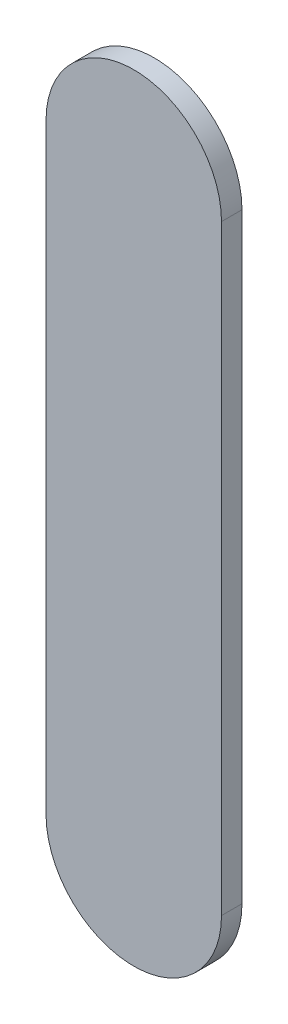
ISO-10303-21;
HEADER;
FILE_DESCRIPTION(('STEP AP214'),'2;1');
FILE_NAME('part.step','',(''),(''),'','','');
FILE_SCHEMA(('AUTOMOTIVE_DESIGN { 1 0 10303 214 1 1 1 1 }'));
ENDSEC;
DATA;
#1=APPLICATION_CONTEXT('core data for automotive mechanical design processes');
#2=APPLICATION_PROTOCOL_DEFINITION('international standard','automotive_design',2000,#1);
#3=PRODUCT_CONTEXT('',#1,'mechanical');
#4=PRODUCT('Part','Part','',(#3));
#5=PRODUCT_RELATED_PRODUCT_CATEGORY('part','',(#4));
#6=PRODUCT_DEFINITION_FORMATION('','',#4);
#7=PRODUCT_DEFINITION_CONTEXT('part definition',#1,'design');
#8=PRODUCT_DEFINITION('design','',#6,#7);
#9=PRODUCT_DEFINITION_SHAPE('','',#8);
#10=(LENGTH_UNIT() NAMED_UNIT(*) SI_UNIT(.MILLI.,.METRE.));
#11=(NAMED_UNIT(*) PLANE_ANGLE_UNIT() SI_UNIT($,.RADIAN.));
#12=(NAMED_UNIT(*) SI_UNIT($,.STERADIAN.) SOLID_ANGLE_UNIT());
#13=UNCERTAINTY_MEASURE_WITH_UNIT(LENGTH_MEASURE(1.E-05),#10,'distance_accuracy_value','');
#14=(GEOMETRIC_REPRESENTATION_CONTEXT(3) GLOBAL_UNCERTAINTY_ASSIGNED_CONTEXT((#13)) GLOBAL_UNIT_ASSIGNED_CONTEXT((#10,
#11,#12)) REPRESENTATION_CONTEXT('',''));
#15=CARTESIAN_POINT('',(0.,0.,0.));
#16=DIRECTION('',(0.,0.,1.));
#17=DIRECTION('',(1.,0.,0.));
#18=AXIS2_PLACEMENT_3D('',#15,#16,#17);
#19=CARTESIAN_POINT('',(129.35,-69.9125,1.635));
#20=DIRECTION('',(0.,0.,1.));
#21=DIRECTION('',(1.,0.,0.));
#22=AXIS2_PLACEMENT_3D('',#19,#20,#21);
#23=PLANE('',#22);
#24=DIRECTION('',(0.,-1.,0.));
#25=VECTOR('',#24,1.);
#26=CARTESIAN_POINT('',(129.35,-69.9125,1.635));
#27=LINE('',#26,#25);
#28=CARTESIAN_POINT('',(129.35,-69.9125,1.635));
#29=VERTEX_POINT('',#28);
#30=CARTESIAN_POINT('',(129.35,-70.94,1.635));
#31=VERTEX_POINT('',#30);
#32=EDGE_CURVE('E82',#29,#31,#27,.T.);
#33=ORIENTED_EDGE('',*,*,#32,.T.);
#34=CARTESIAN_POINT('',(129.5,-70.94,1.635));
#35=DIRECTION('',(0.,0.,1.));
#36=DIRECTION('',(-1.,0.,0.));
#37=AXIS2_PLACEMENT_3D('',#34,#35,#36);
#38=CIRCLE('',#37,0.15);
#39=CARTESIAN_POINT('',(129.65,-70.94,1.635));
#40=VERTEX_POINT('',#39);
#41=EDGE_CURVE('E102',#31,#40,#38,.T.);
#42=ORIENTED_EDGE('',*,*,#41,.T.);
#43=DIRECTION('',(0.,1.,0.));
#44=VECTOR('',#43,1.);
#45=CARTESIAN_POINT('',(129.65,-70.94,1.635));
#46=LINE('',#45,#44);
#47=CARTESIAN_POINT('',(129.65,-69.9125,1.635));
#48=VERTEX_POINT('',#47);
#49=EDGE_CURVE('E75',#40,#48,#46,.T.);
#50=ORIENTED_EDGE('',*,*,#49,.T.);
#51=CARTESIAN_POINT('',(129.5,-69.9125,1.635));
#52=DIRECTION('',(0.,0.,1.));
#53=DIRECTION('',(1.,0.,0.));
#54=AXIS2_PLACEMENT_3D('',#51,#52,#53);
#55=CIRCLE('',#54,0.15);
#56=EDGE_CURVE('E11',#48,#29,#55,.T.);
#57=ORIENTED_EDGE('',*,*,#56,.T.);
#58=EDGE_LOOP('',(#33,#42,#50,#57));
#59=FACE_BOUND('',#58,.T.);
#60=ADVANCED_FACE('F17',(#59),#23,.T.);
#61=CARTESIAN_POINT('',(129.35,-69.9125,1.6));
#62=DIRECTION('',(0.,0.,1.));
#63=DIRECTION('',(1.,0.,0.));
#64=AXIS2_PLACEMENT_3D('',#61,#62,#63);
#65=PLANE('',#64);
#66=CARTESIAN_POINT('',(129.5,-69.9125,1.6));
#67=DIRECTION('',(0.,0.,1.));
#68=DIRECTION('',(1.,0.,0.));
#69=AXIS2_PLACEMENT_3D('',#66,#67,#68);
#70=CIRCLE('',#69,0.15);
#71=CARTESIAN_POINT('',(129.65,-69.9125,1.6));
#72=VERTEX_POINT('',#71);
#73=CARTESIAN_POINT('',(129.35,-69.9125,1.6));
#74=VERTEX_POINT('',#73);
#75=EDGE_CURVE('E26',#72,#74,#70,.T.);
#76=ORIENTED_EDGE('',*,*,#75,.F.);
#77=DIRECTION('',(0.,1.,0.));
#78=VECTOR('',#77,1.);
#79=CARTESIAN_POINT('',(129.65,-70.94,1.6));
#80=LINE('',#79,#78);
#81=CARTESIAN_POINT('',(129.65,-70.94,1.6));
#82=VERTEX_POINT('',#81);
#83=EDGE_CURVE('E110',#82,#72,#80,.T.);
#84=ORIENTED_EDGE('',*,*,#83,.F.);
#85=CARTESIAN_POINT('',(129.5,-70.94,1.6));
#86=DIRECTION('',(0.,0.,1.));
#87=DIRECTION('',(-1.,0.,0.));
#88=AXIS2_PLACEMENT_3D('',#85,#86,#87);
#89=CIRCLE('',#88,0.15);
#90=CARTESIAN_POINT('',(129.35,-70.94,1.6));
#91=VERTEX_POINT('',#90);
#92=EDGE_CURVE('E84',#91,#82,#89,.T.);
#93=ORIENTED_EDGE('',*,*,#92,.F.);
#94=DIRECTION('',(0.,-1.,0.));
#95=VECTOR('',#94,1.);
#96=CARTESIAN_POINT('',(129.35,-69.9125,1.6));
#97=LINE('',#96,#95);
#98=EDGE_CURVE('E80',#74,#91,#97,.T.);
#99=ORIENTED_EDGE('',*,*,#98,.F.);
#100=EDGE_LOOP('',(#76,#84,#93,#99));
#101=FACE_BOUND('',#100,.T.);
#102=ADVANCED_FACE('F19',(#101),#65,.F.);
#103=CARTESIAN_POINT('',(129.5,-69.9125,1.6));
#104=DIRECTION('',(0.,0.,-1.));
#105=DIRECTION('',(1.,0.,0.));
#106=AXIS2_PLACEMENT_3D('',#103,#104,#105);
#107=CYLINDRICAL_SURFACE('',#106,0.15);
#108=ORIENTED_EDGE('',*,*,#75,.T.);
#109=DIRECTION('',(0.,0.,1.));
#110=VECTOR('',#109,1.);
#111=CARTESIAN_POINT('',(129.35,-69.9125,1.6));
#112=LINE('',#111,#110);
#113=EDGE_CURVE('E69',#74,#29,#112,.T.);
#114=ORIENTED_EDGE('',*,*,#113,.T.);
#115=ORIENTED_EDGE('',*,*,#56,.F.);
#116=DIRECTION('',(0.,0.,1.));
#117=VECTOR('',#116,1.);
#118=CARTESIAN_POINT('',(129.65,-69.9125,1.6));
#119=LINE('',#118,#117);
#120=EDGE_CURVE('E72',#72,#48,#119,.T.);
#121=ORIENTED_EDGE('',*,*,#120,.F.);
#122=EDGE_LOOP('',(#108,#114,#115,#121));
#123=FACE_BOUND('',#122,.T.);
#124=ADVANCED_FACE('F68',(#123),#107,.T.);
#125=CARTESIAN_POINT('',(129.65,-70.94,1.6));
#126=DIRECTION('',(-1.,0.,0.));
#127=DIRECTION('',(0.,0.,1.));
#128=AXIS2_PLACEMENT_3D('',#125,#126,#127);
#129=PLANE('',#128);
#130=ORIENTED_EDGE('',*,*,#83,.T.);
#131=ORIENTED_EDGE('',*,*,#120,.T.);
#132=ORIENTED_EDGE('',*,*,#49,.F.);
#133=DIRECTION('',(0.,0.,1.));
#134=VECTOR('',#133,1.);
#135=CARTESIAN_POINT('',(129.65,-70.94,1.6));
#136=LINE('',#135,#134);
#137=EDGE_CURVE('E98',#82,#40,#136,.T.);
#138=ORIENTED_EDGE('',*,*,#137,.F.);
#139=EDGE_LOOP('',(#130,#131,#132,#138));
#140=FACE_BOUND('',#139,.T.);
#141=ADVANCED_FACE('F122',(#140),#129,.F.);
#142=CARTESIAN_POINT('',(129.5,-70.94,1.6));
#143=DIRECTION('',(0.,0.,-1.));
#144=DIRECTION('',(-1.,0.,0.));
#145=AXIS2_PLACEMENT_3D('',#142,#143,#144);
#146=CYLINDRICAL_SURFACE('',#145,0.15);
#147=ORIENTED_EDGE('',*,*,#92,.T.);
#148=ORIENTED_EDGE('',*,*,#137,.T.);
#149=ORIENTED_EDGE('',*,*,#41,.F.);
#150=DIRECTION('',(0.,0.,1.));
#151=VECTOR('',#150,1.);
#152=CARTESIAN_POINT('',(129.35,-70.94,1.6));
#153=LINE('',#152,#151);
#154=EDGE_CURVE('E89',#91,#31,#153,.T.);
#155=ORIENTED_EDGE('',*,*,#154,.F.);
#156=EDGE_LOOP('',(#147,#148,#149,#155));
#157=FACE_BOUND('',#156,.T.);
#158=ADVANCED_FACE('F124',(#157),#146,.T.);
#159=CARTESIAN_POINT('',(129.35,-69.9125,1.6));
#160=DIRECTION('',(1.,0.,0.));
#161=DIRECTION('',(0.,1.,0.));
#162=AXIS2_PLACEMENT_3D('',#159,#160,#161);
#163=PLANE('',#162);
#164=ORIENTED_EDGE('',*,*,#98,.T.);
#165=ORIENTED_EDGE('',*,*,#154,.T.);
#166=ORIENTED_EDGE('',*,*,#32,.F.);
#167=ORIENTED_EDGE('',*,*,#113,.F.);
#168=EDGE_LOOP('',(#164,#165,#166,#167));
#169=FACE_BOUND('',#168,.T.);
#170=ADVANCED_FACE('F78',(#169),#163,.F.);
#171=CLOSED_SHELL('',(#60,#102,#124,#141,#158,#170));
#172=MANIFOLD_SOLID_BREP('B1',#171);
#173=ADVANCED_BREP_SHAPE_REPRESENTATION('',(#18,#172),#14);
#174=SHAPE_DEFINITION_REPRESENTATION(#9,#173);
ENDSEC;
END-ISO-10303-21;
